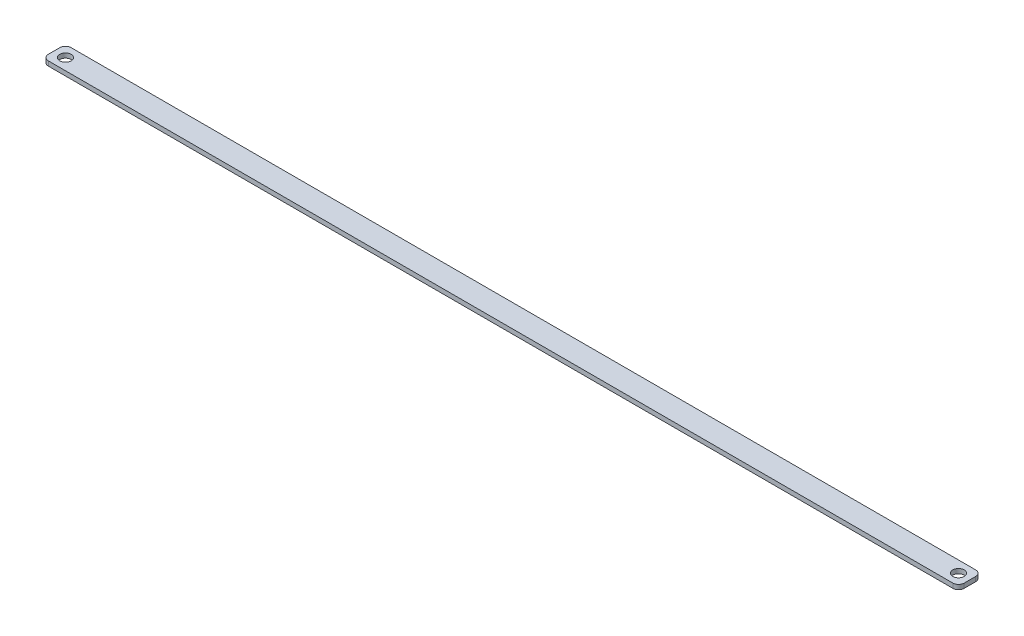
ISO-10303-21;
HEADER;
FILE_DESCRIPTION(('STEP AP214'),'2;1');
FILE_NAME('part.step','',(''),(''),'','','');
FILE_SCHEMA(('AUTOMOTIVE_DESIGN { 1 0 10303 214 1 1 1 1 }'));
ENDSEC;
DATA;
#1=APPLICATION_CONTEXT('core data for automotive mechanical design processes');
#2=APPLICATION_PROTOCOL_DEFINITION('international standard','automotive_design',2000,#1);
#3=PRODUCT_CONTEXT('',#1,'mechanical');
#4=PRODUCT('Part','Part','',(#3));
#5=PRODUCT_RELATED_PRODUCT_CATEGORY('part','',(#4));
#6=PRODUCT_DEFINITION_FORMATION('','',#4);
#7=PRODUCT_DEFINITION_CONTEXT('part definition',#1,'design');
#8=PRODUCT_DEFINITION('design','',#6,#7);
#9=PRODUCT_DEFINITION_SHAPE('','',#8);
#10=(LENGTH_UNIT() NAMED_UNIT(*) SI_UNIT(.MILLI.,.METRE.));
#11=(NAMED_UNIT(*) PLANE_ANGLE_UNIT() SI_UNIT($,.RADIAN.));
#12=(NAMED_UNIT(*) SI_UNIT($,.STERADIAN.) SOLID_ANGLE_UNIT());
#13=UNCERTAINTY_MEASURE_WITH_UNIT(LENGTH_MEASURE(1.E-05),#10,'distance_accuracy_value','');
#14=(GEOMETRIC_REPRESENTATION_CONTEXT(3) GLOBAL_UNCERTAINTY_ASSIGNED_CONTEXT((#13)) GLOBAL_UNIT_ASSIGNED_CONTEXT((#10,
#11,#12)) REPRESENTATION_CONTEXT('',''));
#15=CARTESIAN_POINT('',(0.,0.,0.));
#16=DIRECTION('',(0.,0.,1.));
#17=DIRECTION('',(1.,0.,0.));
#18=AXIS2_PLACEMENT_3D('',#15,#16,#17);
#19=CARTESIAN_POINT('',(224.738287560281,2.,-5.));
#20=DIRECTION('',(0.,-1.,0.));
#21=DIRECTION('',(0.,0.,-1.));
#22=AXIS2_PLACEMENT_3D('',#19,#20,#21);
#23=CYLINDRICAL_SURFACE('',#22,2.5);
#24=CARTESIAN_POINT('',(224.738287560281,0.,-5.));
#25=DIRECTION('',(0.,1.,0.));
#26=DIRECTION('',(0.,0.,1.));
#27=AXIS2_PLACEMENT_3D('',#24,#25,#26);
#28=CIRCLE('',#27,2.5);
#29=CARTESIAN_POINT('',(224.738287560281,0.,-2.5));
#30=VERTEX_POINT('',#29);
#31=EDGE_CURVE('E220',#30,#30,#28,.T.);
#32=ORIENTED_EDGE('',*,*,#31,.F.);
#33=EDGE_LOOP('',(#32));
#34=FACE_BOUND('',#33,.T.);
#35=CARTESIAN_POINT('',(224.738287560281,2.,-5.));
#36=DIRECTION('',(0.,1.,0.));
#37=DIRECTION('',(0.,0.,1.));
#38=AXIS2_PLACEMENT_3D('',#35,#36,#37);
#39=CIRCLE('',#38,2.5);
#40=CARTESIAN_POINT('',(224.738287560281,2.,-2.5));
#41=VERTEX_POINT('',#40);
#42=EDGE_CURVE('E13',#41,#41,#39,.T.);
#43=ORIENTED_EDGE('',*,*,#42,.T.);
#44=EDGE_LOOP('',(#43));
#45=FACE_BOUND('',#44,.T.);
#46=ADVANCED_FACE('F93',(#34,#45),#23,.F.);
#47=CARTESIAN_POINT('',(-166.261712439719,2.,-5.));
#48=DIRECTION('',(0.,-1.,0.));
#49=DIRECTION('',(0.,0.,-1.));
#50=AXIS2_PLACEMENT_3D('',#47,#48,#49);
#51=CYLINDRICAL_SURFACE('',#50,2.5);
#52=CARTESIAN_POINT('',(-166.261712439719,0.,-5.));
#53=DIRECTION('',(0.,1.,0.));
#54=DIRECTION('',(0.,0.,1.));
#55=AXIS2_PLACEMENT_3D('',#52,#53,#54);
#56=CIRCLE('',#55,2.5);
#57=CARTESIAN_POINT('',(-166.261712439719,0.,-2.5));
#58=VERTEX_POINT('',#57);
#59=EDGE_CURVE('E233',#58,#58,#56,.T.);
#60=ORIENTED_EDGE('',*,*,#59,.F.);
#61=EDGE_LOOP('',(#60));
#62=FACE_BOUND('',#61,.T.);
#63=CARTESIAN_POINT('',(-166.261712439719,2.,-5.));
#64=DIRECTION('',(0.,1.,0.));
#65=DIRECTION('',(0.,0.,1.));
#66=AXIS2_PLACEMENT_3D('',#63,#64,#65);
#67=CIRCLE('',#66,2.5);
#68=CARTESIAN_POINT('',(-166.261712439719,2.,-2.5));
#69=VERTEX_POINT('',#68);
#70=EDGE_CURVE('E103',#69,#69,#67,.T.);
#71=ORIENTED_EDGE('',*,*,#70,.T.);
#72=EDGE_LOOP('',(#71));
#73=FACE_BOUND('',#72,.T.);
#74=ADVANCED_FACE('F254',(#62,#73),#51,.F.);
#75=CARTESIAN_POINT('',(47.5,2.,-2.5));
#76=DIRECTION('',(0.,1.,0.));
#77=DIRECTION('',(0.,0.,1.));
#78=AXIS2_PLACEMENT_3D('',#75,#76,#77);
#79=PLANE('',#78);
#80=DIRECTION('',(1.,0.,0.));
#81=VECTOR('',#80,1.);
#82=CARTESIAN_POINT('',(-168.761712439719,2.,0.));
#83=LINE('',#82,#81);
#84=CARTESIAN_POINT('',(-168.761712439719,2.,0.));
#85=VERTEX_POINT('',#84);
#86=CARTESIAN_POINT('',(227.238287560281,2.,0.));
#87=VERTEX_POINT('',#86);
#88=EDGE_CURVE('E156',#85,#87,#83,.T.);
#89=ORIENTED_EDGE('',*,*,#88,.T.);
#90=CARTESIAN_POINT('',(227.238287560281,2.,-2.5));
#91=DIRECTION('',(0.,1.,0.));
#92=DIRECTION('',(0.,0.,1.));
#93=AXIS2_PLACEMENT_3D('',#90,#91,#92);
#94=CIRCLE('',#93,2.5);
#95=CARTESIAN_POINT('',(229.738287560281,2.,-2.50000000000002));
#96=VERTEX_POINT('',#95);
#97=EDGE_CURVE('E162',#87,#96,#94,.T.);
#98=ORIENTED_EDGE('',*,*,#97,.T.);
#99=DIRECTION('',(0.,0.,-1.));
#100=VECTOR('',#99,1.);
#101=CARTESIAN_POINT('',(229.738287560281,2.,-2.50000000000002));
#102=LINE('',#101,#100);
#103=CARTESIAN_POINT('',(229.738287560281,2.,-7.49999999999998));
#104=VERTEX_POINT('',#103);
#105=EDGE_CURVE('E184',#96,#104,#102,.T.);
#106=ORIENTED_EDGE('',*,*,#105,.T.);
#107=CARTESIAN_POINT('',(227.238287560281,2.,-7.5));
#108=DIRECTION('',(0.,1.,0.));
#109=DIRECTION('',(0.,0.,-1.));
#110=AXIS2_PLACEMENT_3D('',#107,#108,#109);
#111=CIRCLE('',#110,2.5);
#112=CARTESIAN_POINT('',(227.238287560281,2.,-10.));
#113=VERTEX_POINT('',#112);
#114=EDGE_CURVE('E188',#104,#113,#111,.T.);
#115=ORIENTED_EDGE('',*,*,#114,.T.);
#116=DIRECTION('',(-1.,0.,0.));
#117=VECTOR('',#116,1.);
#118=CARTESIAN_POINT('',(182.238287560281,2.,-10.));
#119=LINE('',#118,#117);
#120=CARTESIAN_POINT('',(-168.761712439719,2.,-10.));
#121=VERTEX_POINT('',#120);
#122=EDGE_CURVE('E242',#113,#121,#119,.T.);
#123=ORIENTED_EDGE('',*,*,#122,.T.);
#124=CARTESIAN_POINT('',(-168.761712439719,2.,-7.5));
#125=DIRECTION('',(0.,1.,0.));
#126=DIRECTION('',(0.,0.,-1.));
#127=AXIS2_PLACEMENT_3D('',#124,#125,#126);
#128=CIRCLE('',#127,2.5);
#129=CARTESIAN_POINT('',(-171.261712439719,2.,-7.49999999999998));
#130=VERTEX_POINT('',#129);
#131=EDGE_CURVE('E168',#121,#130,#128,.T.);
#132=ORIENTED_EDGE('',*,*,#131,.T.);
#133=DIRECTION('',(0.,0.,1.));
#134=VECTOR('',#133,1.);
#135=CARTESIAN_POINT('',(-171.261712439719,2.,-2.50000000000002));
#136=LINE('',#135,#134);
#137=CARTESIAN_POINT('',(-171.261712439719,2.,-2.50000000000002));
#138=VERTEX_POINT('',#137);
#139=EDGE_CURVE('E186',#130,#138,#136,.T.);
#140=ORIENTED_EDGE('',*,*,#139,.T.);
#141=CARTESIAN_POINT('',(-168.761712439719,2.,-2.5));
#142=DIRECTION('',(0.,1.,0.));
#143=DIRECTION('',(0.,0.,-1.));
#144=AXIS2_PLACEMENT_3D('',#141,#142,#143);
#145=CIRCLE('',#144,2.5);
#146=EDGE_CURVE('E165',#138,#85,#145,.T.);
#147=ORIENTED_EDGE('',*,*,#146,.T.);
#148=EDGE_LOOP('',(#89,#98,#106,#115,#123,#132,#140,#147));
#149=FACE_BOUND('',#148,.T.);
#150=ORIENTED_EDGE('',*,*,#42,.F.);
#151=EDGE_LOOP('',(#150));
#152=FACE_BOUND('',#151,.T.);
#153=ORIENTED_EDGE('',*,*,#70,.F.);
#154=EDGE_LOOP('',(#153));
#155=FACE_BOUND('',#154,.T.);
#156=ADVANCED_FACE('F158',(#149,#152,#155),#79,.T.);
#157=CARTESIAN_POINT('',(227.238287560281,0.,-2.5));
#158=DIRECTION('',(0.,1.,0.));
#159=DIRECTION('',(0.,0.,1.));
#160=AXIS2_PLACEMENT_3D('',#157,#158,#159);
#161=PLANE('',#160);
#162=ORIENTED_EDGE('',*,*,#31,.T.);
#163=EDGE_LOOP('',(#162));
#164=FACE_BOUND('',#163,.T.);
#165=CARTESIAN_POINT('',(227.238287560281,0.,-2.5));
#166=DIRECTION('',(0.,1.,0.));
#167=DIRECTION('',(0.,0.,1.));
#168=AXIS2_PLACEMENT_3D('',#165,#166,#167);
#169=CIRCLE('',#168,2.5);
#170=CARTESIAN_POINT('',(227.238287560281,0.,0.));
#171=VERTEX_POINT('',#170);
#172=CARTESIAN_POINT('',(229.738287560281,0.,-2.50000000000002));
#173=VERTEX_POINT('',#172);
#174=EDGE_CURVE('E177',#171,#173,#169,.T.);
#175=ORIENTED_EDGE('',*,*,#174,.F.);
#176=DIRECTION('',(1.,0.,0.));
#177=VECTOR('',#176,1.);
#178=CARTESIAN_POINT('',(-168.761712439719,0.,0.));
#179=LINE('',#178,#177);
#180=CARTESIAN_POINT('',(-168.761712439719,0.,0.));
#181=VERTEX_POINT('',#180);
#182=EDGE_CURVE('E173',#181,#171,#179,.T.);
#183=ORIENTED_EDGE('',*,*,#182,.F.);
#184=CARTESIAN_POINT('',(-168.761712439719,0.,-2.5));
#185=DIRECTION('',(0.,1.,0.));
#186=DIRECTION('',(0.,0.,-1.));
#187=AXIS2_PLACEMENT_3D('',#184,#185,#186);
#188=CIRCLE('',#187,2.5);
#189=CARTESIAN_POINT('',(-171.261712439719,0.,-2.50000000000002));
#190=VERTEX_POINT('',#189);
#191=EDGE_CURVE('E199',#190,#181,#188,.T.);
#192=ORIENTED_EDGE('',*,*,#191,.F.);
#193=DIRECTION('',(0.,0.,1.));
#194=VECTOR('',#193,1.);
#195=CARTESIAN_POINT('',(-171.261712439719,0.,-2.50000000000002));
#196=LINE('',#195,#194);
#197=CARTESIAN_POINT('',(-171.261712439719,0.,-7.49999999999998));
#198=VERTEX_POINT('',#197);
#199=EDGE_CURVE('E206',#198,#190,#196,.T.);
#200=ORIENTED_EDGE('',*,*,#199,.F.);
#201=CARTESIAN_POINT('',(-168.761712439719,0.,-7.5));
#202=DIRECTION('',(0.,1.,0.));
#203=DIRECTION('',(0.,0.,-1.));
#204=AXIS2_PLACEMENT_3D('',#201,#202,#203);
#205=CIRCLE('',#204,2.5);
#206=CARTESIAN_POINT('',(-168.761712439719,0.,-10.));
#207=VERTEX_POINT('',#206);
#208=EDGE_CURVE('E212',#207,#198,#205,.T.);
#209=ORIENTED_EDGE('',*,*,#208,.F.);
#210=DIRECTION('',(-1.,0.,0.));
#211=VECTOR('',#210,1.);
#212=CARTESIAN_POINT('',(182.238287560281,0.,-10.));
#213=LINE('',#212,#211);
#214=CARTESIAN_POINT('',(227.238287560281,0.,-10.));
#215=VERTEX_POINT('',#214);
#216=EDGE_CURVE('E218',#215,#207,#213,.T.);
#217=ORIENTED_EDGE('',*,*,#216,.F.);
#218=CARTESIAN_POINT('',(227.238287560281,0.,-7.5));
#219=DIRECTION('',(0.,1.,0.));
#220=DIRECTION('',(0.,0.,-1.));
#221=AXIS2_PLACEMENT_3D('',#218,#219,#220);
#222=CIRCLE('',#221,2.5);
#223=CARTESIAN_POINT('',(229.738287560281,0.,-7.49999999999998));
#224=VERTEX_POINT('',#223);
#225=EDGE_CURVE('E223',#224,#215,#222,.T.);
#226=ORIENTED_EDGE('',*,*,#225,.F.);
#227=DIRECTION('',(0.,0.,-1.));
#228=VECTOR('',#227,1.);
#229=CARTESIAN_POINT('',(229.738287560281,0.,-2.50000000000002));
#230=LINE('',#229,#228);
#231=EDGE_CURVE('E178',#173,#224,#230,.T.);
#232=ORIENTED_EDGE('',*,*,#231,.F.);
#233=EDGE_LOOP('',(#175,#183,#192,#200,#209,#217,#226,#232));
#234=FACE_BOUND('',#233,.T.);
#235=ORIENTED_EDGE('',*,*,#59,.T.);
#236=EDGE_LOOP('',(#235));
#237=FACE_BOUND('',#236,.T.);
#238=ADVANCED_FACE('F249',(#164,#234,#237),#161,.F.);
#239=CARTESIAN_POINT('',(182.238287560281,2.,-10.));
#240=DIRECTION('',(0.,0.,1.));
#241=DIRECTION('',(1.,0.,0.));
#242=AXIS2_PLACEMENT_3D('',#239,#240,#241);
#243=PLANE('',#242);
#244=ORIENTED_EDGE('',*,*,#216,.T.);
#245=DIRECTION('',(0.,-1.,0.));
#246=VECTOR('',#245,1.);
#247=CARTESIAN_POINT('',(-168.761712439719,2.,-10.));
#248=LINE('',#247,#246);
#249=EDGE_CURVE('E209',#121,#207,#248,.T.);
#250=ORIENTED_EDGE('',*,*,#249,.F.);
#251=ORIENTED_EDGE('',*,*,#122,.F.);
#252=DIRECTION('',(0.,-1.,0.));
#253=VECTOR('',#252,1.);
#254=CARTESIAN_POINT('',(227.238287560281,2.,-10.));
#255=LINE('',#254,#253);
#256=EDGE_CURVE('E112',#113,#215,#255,.T.);
#257=ORIENTED_EDGE('',*,*,#256,.T.);
#258=EDGE_LOOP('',(#244,#250,#251,#257));
#259=FACE_BOUND('',#258,.T.);
#260=ADVANCED_FACE('F271',(#259),#243,.F.);
#261=CARTESIAN_POINT('',(182.238287560281,2.,0.));
#262=DIRECTION('',(0.,0.,-1.));
#263=DIRECTION('',(-1.,0.,0.));
#264=AXIS2_PLACEMENT_3D('',#261,#262,#263);
#265=PLANE('',#264);
#266=DIRECTION('',(0.,-1.,0.));
#267=VECTOR('',#266,1.);
#268=CARTESIAN_POINT('',(227.238287560281,2.,0.));
#269=LINE('',#268,#267);
#270=EDGE_CURVE('E171',#87,#171,#269,.T.);
#271=ORIENTED_EDGE('',*,*,#270,.F.);
#272=ORIENTED_EDGE('',*,*,#88,.F.);
#273=DIRECTION('',(0.,-1.,0.));
#274=VECTOR('',#273,1.);
#275=CARTESIAN_POINT('',(-168.761712439719,2.,0.));
#276=LINE('',#275,#274);
#277=EDGE_CURVE('E196',#85,#181,#276,.T.);
#278=ORIENTED_EDGE('',*,*,#277,.T.);
#279=ORIENTED_EDGE('',*,*,#182,.T.);
#280=EDGE_LOOP('',(#271,#272,#278,#279));
#281=FACE_BOUND('',#280,.T.);
#282=ADVANCED_FACE('F172',(#281),#265,.F.);
#283=CARTESIAN_POINT('',(227.238287560281,2.,-2.5));
#284=DIRECTION('',(0.,-1.,0.));
#285=DIRECTION('',(0.,0.,-1.));
#286=AXIS2_PLACEMENT_3D('',#283,#284,#285);
#287=CYLINDRICAL_SURFACE('',#286,2.5);
#288=ORIENTED_EDGE('',*,*,#174,.T.);
#289=DIRECTION('',(0.,-1.,0.));
#290=VECTOR('',#289,1.);
#291=CARTESIAN_POINT('',(229.738287560281,2.,-2.50000000000002));
#292=LINE('',#291,#290);
#293=EDGE_CURVE('E182',#96,#173,#292,.T.);
#294=ORIENTED_EDGE('',*,*,#293,.F.);
#295=ORIENTED_EDGE('',*,*,#97,.F.);
#296=ORIENTED_EDGE('',*,*,#270,.T.);
#297=EDGE_LOOP('',(#288,#294,#295,#296));
#298=FACE_BOUND('',#297,.T.);
#299=ADVANCED_FACE('F180',(#298),#287,.T.);
#300=CARTESIAN_POINT('',(229.738287560281,2.,-2.50000000000002));
#301=DIRECTION('',(-1.,0.,0.));
#302=DIRECTION('',(0.,0.,1.));
#303=AXIS2_PLACEMENT_3D('',#300,#301,#302);
#304=PLANE('',#303);
#305=ORIENTED_EDGE('',*,*,#231,.T.);
#306=DIRECTION('',(0.,-1.,0.));
#307=VECTOR('',#306,1.);
#308=CARTESIAN_POINT('',(229.738287560281,2.,-7.49999999999998));
#309=LINE('',#308,#307);
#310=EDGE_CURVE('E215',#104,#224,#309,.T.);
#311=ORIENTED_EDGE('',*,*,#310,.F.);
#312=ORIENTED_EDGE('',*,*,#105,.F.);
#313=ORIENTED_EDGE('',*,*,#293,.T.);
#314=EDGE_LOOP('',(#305,#311,#312,#313));
#315=FACE_BOUND('',#314,.T.);
#316=ADVANCED_FACE('F278',(#315),#304,.F.);
#317=CARTESIAN_POINT('',(227.238287560281,2.,-7.5));
#318=DIRECTION('',(0.,-1.,0.));
#319=DIRECTION('',(0.,0.,-1.));
#320=AXIS2_PLACEMENT_3D('',#317,#318,#319);
#321=CYLINDRICAL_SURFACE('',#320,2.5);
#322=ORIENTED_EDGE('',*,*,#225,.T.);
#323=ORIENTED_EDGE('',*,*,#256,.F.);
#324=ORIENTED_EDGE('',*,*,#114,.F.);
#325=ORIENTED_EDGE('',*,*,#310,.T.);
#326=EDGE_LOOP('',(#322,#323,#324,#325));
#327=FACE_BOUND('',#326,.T.);
#328=ADVANCED_FACE('F281',(#327),#321,.T.);
#329=CARTESIAN_POINT('',(-168.761712439719,2.,-7.5));
#330=DIRECTION('',(0.,-1.,0.));
#331=DIRECTION('',(0.,0.,-1.));
#332=AXIS2_PLACEMENT_3D('',#329,#330,#331);
#333=CYLINDRICAL_SURFACE('',#332,2.5);
#334=ORIENTED_EDGE('',*,*,#208,.T.);
#335=DIRECTION('',(0.,-1.,0.));
#336=VECTOR('',#335,1.);
#337=CARTESIAN_POINT('',(-171.261712439719,2.,-7.49999999999998));
#338=LINE('',#337,#336);
#339=EDGE_CURVE('E202',#130,#198,#338,.T.);
#340=ORIENTED_EDGE('',*,*,#339,.F.);
#341=ORIENTED_EDGE('',*,*,#131,.F.);
#342=ORIENTED_EDGE('',*,*,#249,.T.);
#343=EDGE_LOOP('',(#334,#340,#341,#342));
#344=FACE_BOUND('',#343,.T.);
#345=ADVANCED_FACE('F285',(#344),#333,.T.);
#346=CARTESIAN_POINT('',(-171.261712439719,2.,-2.50000000000002));
#347=DIRECTION('',(1.,0.,0.));
#348=DIRECTION('',(0.,0.,-1.));
#349=AXIS2_PLACEMENT_3D('',#346,#347,#348);
#350=PLANE('',#349);
#351=ORIENTED_EDGE('',*,*,#199,.T.);
#352=DIRECTION('',(0.,-1.,0.));
#353=VECTOR('',#352,1.);
#354=CARTESIAN_POINT('',(-171.261712439719,2.,-2.50000000000002));
#355=LINE('',#354,#353);
#356=EDGE_CURVE('E203',#138,#190,#355,.T.);
#357=ORIENTED_EDGE('',*,*,#356,.F.);
#358=ORIENTED_EDGE('',*,*,#139,.F.);
#359=ORIENTED_EDGE('',*,*,#339,.T.);
#360=EDGE_LOOP('',(#351,#357,#358,#359));
#361=FACE_BOUND('',#360,.T.);
#362=ADVANCED_FACE('F288',(#361),#350,.F.);
#363=CARTESIAN_POINT('',(-168.761712439719,2.,-2.5));
#364=DIRECTION('',(0.,-1.,0.));
#365=DIRECTION('',(0.,0.,-1.));
#366=AXIS2_PLACEMENT_3D('',#363,#364,#365);
#367=CYLINDRICAL_SURFACE('',#366,2.5);
#368=ORIENTED_EDGE('',*,*,#191,.T.);
#369=ORIENTED_EDGE('',*,*,#277,.F.);
#370=ORIENTED_EDGE('',*,*,#146,.F.);
#371=ORIENTED_EDGE('',*,*,#356,.T.);
#372=EDGE_LOOP('',(#368,#369,#370,#371));
#373=FACE_BOUND('',#372,.T.);
#374=ADVANCED_FACE('F95',(#373),#367,.T.);
#375=CLOSED_SHELL('',(#46,#74,#156,#238,#260,#282,#299,#316,#328,#345,#362,#374));
#376=MANIFOLD_SOLID_BREP('B2',#375);
#377=ADVANCED_BREP_SHAPE_REPRESENTATION('',(#18,#376),#14);
#378=SHAPE_DEFINITION_REPRESENTATION(#9,#377);
ENDSEC;
END-ISO-10303-21;
